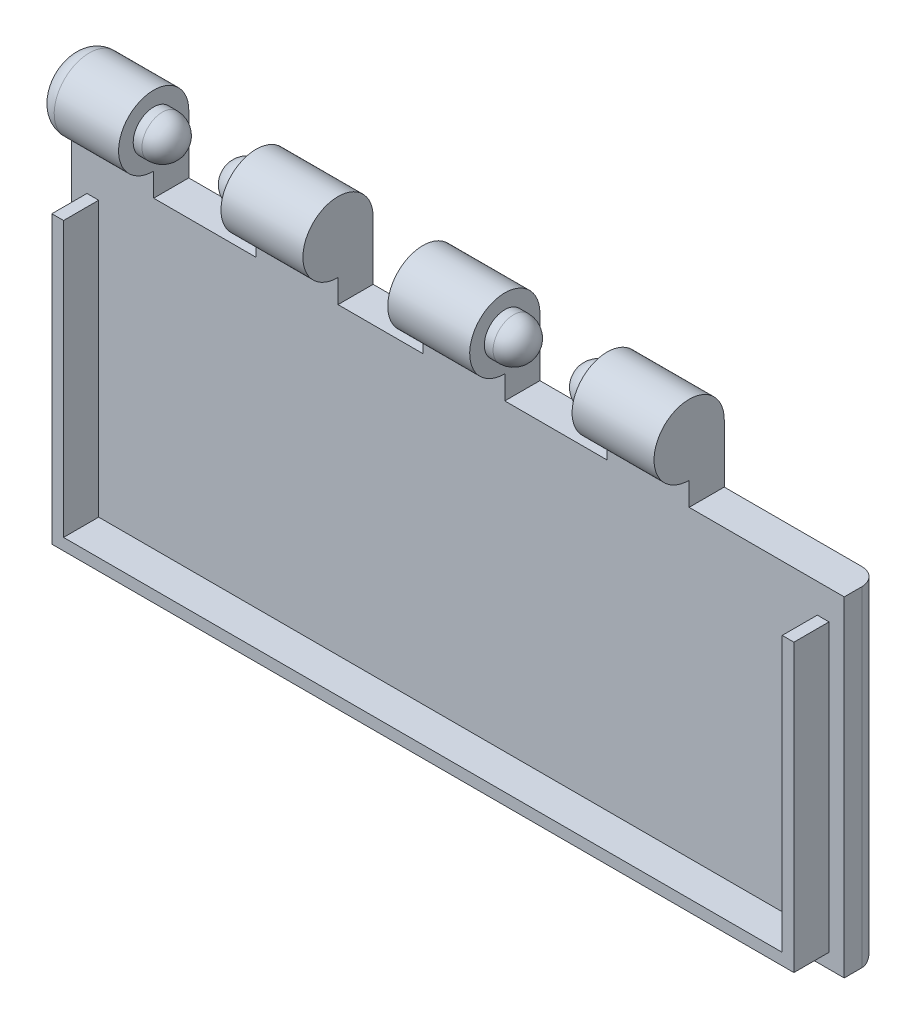
ISO-10303-21;
HEADER;
FILE_DESCRIPTION(('STEP AP214'),'2;1');
FILE_NAME('part.step','',(''),(''),'','','');
FILE_SCHEMA(('AUTOMOTIVE_DESIGN { 1 0 10303 214 1 1 1 1 }'));
ENDSEC;
DATA;
#1=APPLICATION_CONTEXT('core data for automotive mechanical design processes');
#2=APPLICATION_PROTOCOL_DEFINITION('international standard','automotive_design',2000,#1);
#3=PRODUCT_CONTEXT('',#1,'mechanical');
#4=PRODUCT('Part','Part','',(#3));
#5=PRODUCT_RELATED_PRODUCT_CATEGORY('part','',(#4));
#6=PRODUCT_DEFINITION_FORMATION('','',#4);
#7=PRODUCT_DEFINITION_CONTEXT('part definition',#1,'design');
#8=PRODUCT_DEFINITION('design','',#6,#7);
#9=PRODUCT_DEFINITION_SHAPE('','',#8);
#10=(LENGTH_UNIT() NAMED_UNIT(*) SI_UNIT(.MILLI.,.METRE.));
#11=(NAMED_UNIT(*) PLANE_ANGLE_UNIT() SI_UNIT($,.RADIAN.));
#12=(NAMED_UNIT(*) SI_UNIT($,.STERADIAN.) SOLID_ANGLE_UNIT());
#13=UNCERTAINTY_MEASURE_WITH_UNIT(LENGTH_MEASURE(1.E-05),#10,'distance_accuracy_value','');
#14=(GEOMETRIC_REPRESENTATION_CONTEXT(3) GLOBAL_UNCERTAINTY_ASSIGNED_CONTEXT((#13)) GLOBAL_UNIT_ASSIGNED_CONTEXT((#10,
#11,#12)) REPRESENTATION_CONTEXT('',''));
#15=CARTESIAN_POINT('',(0.,0.,0.));
#16=DIRECTION('',(0.,0.,1.));
#17=DIRECTION('',(1.,0.,0.));
#18=AXIS2_PLACEMENT_3D('',#15,#16,#17);
#19=CARTESIAN_POINT('',(0.,0.,3.));
#20=DIRECTION('',(0.,0.,-1.));
#21=DIRECTION('',(-1.,0.,0.));
#22=AXIS2_PLACEMENT_3D('',#19,#20,#21);
#23=PLANE('',#22);
#24=DIRECTION('',(0.,1.,0.));
#25=VECTOR('',#24,1.);
#26=CARTESIAN_POINT('',(33.,-14.1,3.));
#27=LINE('',#26,#25);
#28=CARTESIAN_POINT('',(33.,-14.1,3.));
#29=VERTEX_POINT('',#28);
#30=CARTESIAN_POINT('',(33.,14.1,3.));
#31=VERTEX_POINT('',#30);
#32=EDGE_CURVE('E434',#29,#31,#27,.T.);
#33=ORIENTED_EDGE('',*,*,#32,.T.);
#34=DIRECTION('',(-1.,0.,0.));
#35=VECTOR('',#34,1.);
#36=CARTESIAN_POINT('',(-33.,14.1,3.));
#37=LINE('',#36,#35);
#38=CARTESIAN_POINT('',(19.75,14.1,3.));
#39=VERTEX_POINT('',#38);
#40=EDGE_CURVE('E440',#31,#39,#37,.T.);
#41=ORIENTED_EDGE('',*,*,#40,.T.);
#42=DIRECTION('',(0.,1.,0.));
#43=VECTOR('',#42,1.);
#44=CARTESIAN_POINT('',(19.75,14.1,2.99999999999999));
#45=LINE('',#44,#43);
#46=CARTESIAN_POINT('',(19.75,16.1,2.99999999999999));
#47=VERTEX_POINT('',#46);
#48=EDGE_CURVE('E280',#39,#47,#45,.T.);
#49=ORIENTED_EDGE('',*,*,#48,.T.);
#50=DIRECTION('',(1.,0.,0.));
#51=VECTOR('',#50,1.);
#52=CARTESIAN_POINT('',(12.75,16.1,3.));
#53=LINE('',#52,#51);
#54=CARTESIAN_POINT('',(12.75,16.1,3.));
#55=VERTEX_POINT('',#54);
#56=EDGE_CURVE('E310',#55,#47,#53,.T.);
#57=ORIENTED_EDGE('',*,*,#56,.F.);
#58=DIRECTION('',(0.,1.,0.));
#59=VECTOR('',#58,1.);
#60=CARTESIAN_POINT('',(12.75,14.1,3.));
#61=LINE('',#60,#59);
#62=CARTESIAN_POINT('',(12.75,14.1,3.));
#63=VERTEX_POINT('',#62);
#64=EDGE_CURVE('E281',#63,#55,#61,.T.);
#65=ORIENTED_EDGE('',*,*,#64,.F.);
#66=CARTESIAN_POINT('',(4.,14.1,3.));
#67=VERTEX_POINT('',#66);
#68=EDGE_CURVE('E445',#63,#67,#37,.T.);
#69=ORIENTED_EDGE('',*,*,#68,.T.);
#70=DIRECTION('',(0.,1.,0.));
#71=VECTOR('',#70,1.);
#72=CARTESIAN_POINT('',(4.,14.1,3.));
#73=LINE('',#72,#71);
#74=CARTESIAN_POINT('',(4.,16.1,3.));
#75=VERTEX_POINT('',#74);
#76=EDGE_CURVE('E322',#67,#75,#73,.T.);
#77=ORIENTED_EDGE('',*,*,#76,.T.);
#78=DIRECTION('',(-1.,0.,0.));
#79=VECTOR('',#78,1.);
#80=CARTESIAN_POINT('',(4.,16.1,3.));
#81=LINE('',#80,#79);
#82=CARTESIAN_POINT('',(-3.,16.1,3.));
#83=VERTEX_POINT('',#82);
#84=EDGE_CURVE('E339',#75,#83,#81,.T.);
#85=ORIENTED_EDGE('',*,*,#84,.T.);
#86=DIRECTION('',(0.,1.,0.));
#87=VECTOR('',#86,1.);
#88=CARTESIAN_POINT('',(-3.,14.1,3.));
#89=LINE('',#88,#87);
#90=CARTESIAN_POINT('',(-3.,14.1,3.));
#91=VERTEX_POINT('',#90);
#92=EDGE_CURVE('E321',#91,#83,#89,.T.);
#93=ORIENTED_EDGE('',*,*,#92,.F.);
#94=CARTESIAN_POINT('',(-10.25,14.1,3.));
#95=VERTEX_POINT('',#94);
#96=EDGE_CURVE('E575',#91,#95,#37,.T.);
#97=ORIENTED_EDGE('',*,*,#96,.T.);
#98=DIRECTION('',(0.,1.,0.));
#99=VECTOR('',#98,1.);
#100=CARTESIAN_POINT('',(-10.25,14.1,2.99999999999999));
#101=LINE('',#100,#99);
#102=CARTESIAN_POINT('',(-10.25,16.1,2.99999999999999));
#103=VERTEX_POINT('',#102);
#104=EDGE_CURVE('E367',#95,#103,#101,.T.);
#105=ORIENTED_EDGE('',*,*,#104,.T.);
#106=DIRECTION('',(1.,0.,0.));
#107=VECTOR('',#106,1.);
#108=CARTESIAN_POINT('',(-17.25,16.1,3.));
#109=LINE('',#108,#107);
#110=CARTESIAN_POINT('',(-17.25,16.1,3.));
#111=VERTEX_POINT('',#110);
#112=EDGE_CURVE('E398',#111,#103,#109,.T.);
#113=ORIENTED_EDGE('',*,*,#112,.F.);
#114=DIRECTION('',(0.,1.,0.));
#115=VECTOR('',#114,1.);
#116=CARTESIAN_POINT('',(-17.25,14.1,3.));
#117=LINE('',#116,#115);
#118=CARTESIAN_POINT('',(-17.25,14.1,3.));
#119=VERTEX_POINT('',#118);
#120=EDGE_CURVE('E368',#119,#111,#117,.T.);
#121=ORIENTED_EDGE('',*,*,#120,.F.);
#122=CARTESIAN_POINT('',(-26.,14.1,3.));
#123=VERTEX_POINT('',#122);
#124=EDGE_CURVE('E438',#119,#123,#37,.T.);
#125=ORIENTED_EDGE('',*,*,#124,.T.);
#126=DIRECTION('',(0.,1.,0.));
#127=VECTOR('',#126,1.);
#128=CARTESIAN_POINT('',(-26.,14.1,3.));
#129=LINE('',#128,#127);
#130=CARTESIAN_POINT('',(-26.,16.1,3.));
#131=VERTEX_POINT('',#130);
#132=EDGE_CURVE('E409',#123,#131,#129,.T.);
#133=ORIENTED_EDGE('',*,*,#132,.T.);
#134=DIRECTION('',(-1.,0.,0.));
#135=VECTOR('',#134,1.);
#136=CARTESIAN_POINT('',(-26.,16.1,3.));
#137=LINE('',#136,#135);
#138=CARTESIAN_POINT('',(-31.5,16.1,3.));
#139=VERTEX_POINT('',#138);
#140=EDGE_CURVE('E425',#131,#139,#137,.T.);
#141=ORIENTED_EDGE('',*,*,#140,.T.);
#142=CARTESIAN_POINT('',(-31.5,17.6,3.));
#143=DIRECTION('',(0.,0.,-1.));
#144=DIRECTION('',(-1.,0.,0.));
#145=AXIS2_PLACEMENT_3D('',#142,#143,#144);
#146=CIRCLE('',#145,1.5);
#147=CARTESIAN_POINT('',(-33.,17.6,3.));
#148=VERTEX_POINT('',#147);
#149=EDGE_CURVE('E11',#139,#148,#146,.T.);
#150=ORIENTED_EDGE('',*,*,#149,.T.);
#151=DIRECTION('',(0.,-1.,0.));
#152=VECTOR('',#151,1.);
#153=CARTESIAN_POINT('',(-33.,-14.1,3.));
#154=LINE('',#153,#152);
#155=CARTESIAN_POINT('',(-33.,-14.1,3.));
#156=VERTEX_POINT('',#155);
#157=EDGE_CURVE('E444',#148,#156,#154,.T.);
#158=ORIENTED_EDGE('',*,*,#157,.T.);
#159=DIRECTION('',(1.,0.,0.));
#160=VECTOR('',#159,1.);
#161=CARTESIAN_POINT('',(-33.,-14.1,3.));
#162=LINE('',#161,#160);
#163=EDGE_CURVE('E448',#156,#29,#162,.T.);
#164=ORIENTED_EDGE('',*,*,#163,.T.);
#165=EDGE_LOOP('',(#33,#41,#49,#57,#65,#69,#77,#85,#93,#97,#105,#113,#121,#125,#133,#141,#150,
#158,#164));
#166=FACE_BOUND('',#165,.T.);
#167=DIRECTION('',(0.,-1.,0.));
#168=VECTOR('',#167,1.);
#169=CARTESIAN_POINT('',(-31.7,11.6,3.));
#170=LINE('',#169,#168);
#171=CARTESIAN_POINT('',(-31.7,11.6,3.));
#172=VERTEX_POINT('',#171);
#173=CARTESIAN_POINT('',(-31.7,-12.85,3.));
#174=VERTEX_POINT('',#173);
#175=EDGE_CURVE('E260',#172,#174,#170,.T.);
#176=ORIENTED_EDGE('',*,*,#175,.F.);
#177=DIRECTION('',(-1.,0.,0.));
#178=VECTOR('',#177,1.);
#179=CARTESIAN_POINT('',(-31.7,11.6,3.));
#180=LINE('',#179,#178);
#181=CARTESIAN_POINT('',(-30.7,11.6,3.));
#182=VERTEX_POINT('',#181);
#183=EDGE_CURVE('E257',#182,#172,#180,.T.);
#184=ORIENTED_EDGE('',*,*,#183,.F.);
#185=DIRECTION('',(0.,1.,0.));
#186=VECTOR('',#185,1.);
#187=CARTESIAN_POINT('',(-30.7,11.6,3.));
#188=LINE('',#187,#186);
#189=CARTESIAN_POINT('',(-30.7,-11.85,3.));
#190=VERTEX_POINT('',#189);
#191=EDGE_CURVE('E893',#190,#182,#188,.T.);
#192=ORIENTED_EDGE('',*,*,#191,.F.);
#193=DIRECTION('',(-1.,0.,0.));
#194=VECTOR('',#193,1.);
#195=CARTESIAN_POINT('',(-30.7,-11.85,3.));
#196=LINE('',#195,#194);
#197=CARTESIAN_POINT('',(30.7,-11.85,3.));
#198=VERTEX_POINT('',#197);
#199=EDGE_CURVE('E935',#198,#190,#196,.T.);
#200=ORIENTED_EDGE('',*,*,#199,.F.);
#201=DIRECTION('',(0.,-1.,0.));
#202=VECTOR('',#201,1.);
#203=CARTESIAN_POINT('',(30.7,11.6,3.));
#204=LINE('',#203,#202);
#205=CARTESIAN_POINT('',(30.7,11.6,3.));
#206=VERTEX_POINT('',#205);
#207=EDGE_CURVE('E927',#206,#198,#204,.T.);
#208=ORIENTED_EDGE('',*,*,#207,.F.);
#209=DIRECTION('',(-1.,0.,0.));
#210=VECTOR('',#209,1.);
#211=CARTESIAN_POINT('',(31.7,11.6,3.));
#212=LINE('',#211,#210);
#213=CARTESIAN_POINT('',(31.7,11.6,3.));
#214=VERTEX_POINT('',#213);
#215=EDGE_CURVE('E921',#214,#206,#212,.T.);
#216=ORIENTED_EDGE('',*,*,#215,.F.);
#217=DIRECTION('',(0.,1.,0.));
#218=VECTOR('',#217,1.);
#219=CARTESIAN_POINT('',(31.7,11.6,3.));
#220=LINE('',#219,#218);
#221=CARTESIAN_POINT('',(31.7,-12.85,3.));
#222=VERTEX_POINT('',#221);
#223=EDGE_CURVE('E70',#222,#214,#220,.T.);
#224=ORIENTED_EDGE('',*,*,#223,.F.);
#225=DIRECTION('',(1.,0.,0.));
#226=VECTOR('',#225,1.);
#227=CARTESIAN_POINT('',(-30.7,-12.85,3.));
#228=LINE('',#227,#226);
#229=EDGE_CURVE('E65',#174,#222,#228,.T.);
#230=ORIENTED_EDGE('',*,*,#229,.F.);
#231=EDGE_LOOP('',(#176,#184,#192,#200,#208,#216,#224,#230));
#232=FACE_BOUND('',#231,.T.);
#233=ADVANCED_FACE('F47',(#166,#232),#23,.F.);
#234=CARTESIAN_POINT('',(-33.,14.1,3.));
#235=DIRECTION('',(0.,-1.,0.));
#236=DIRECTION('',(0.,0.,-1.));
#237=AXIS2_PLACEMENT_3D('',#234,#235,#236);
#238=PLANE('',#237);
#239=DIRECTION('',(0.,0.,1.));
#240=VECTOR('',#239,1.);
#241=CARTESIAN_POINT('',(12.75,14.1,0.));
#242=LINE('',#241,#240);
#243=CARTESIAN_POINT('',(12.75,14.1,0.));
#244=VERTEX_POINT('',#243);
#245=EDGE_CURVE('E285',#244,#63,#242,.T.);
#246=ORIENTED_EDGE('',*,*,#245,.F.);
#247=DIRECTION('',(-1.,0.,0.));
#248=VECTOR('',#247,1.);
#249=CARTESIAN_POINT('',(-33.,14.1,0.));
#250=LINE('',#249,#248);
#251=CARTESIAN_POINT('',(4.,14.1,0.));
#252=VERTEX_POINT('',#251);
#253=EDGE_CURVE('E454',#244,#252,#250,.T.);
#254=ORIENTED_EDGE('',*,*,#253,.T.);
#255=DIRECTION('',(0.,0.,1.));
#256=VECTOR('',#255,1.);
#257=CARTESIAN_POINT('',(4.,14.1,0.));
#258=LINE('',#257,#256);
#259=EDGE_CURVE('E335',#252,#67,#258,.T.);
#260=ORIENTED_EDGE('',*,*,#259,.T.);
#261=ORIENTED_EDGE('',*,*,#68,.F.);
#262=EDGE_LOOP('',(#246,#254,#260,#261));
#263=FACE_BOUND('',#262,.T.);
#264=ADVANCED_FACE('F571',(#263),#238,.F.);
#265=DIRECTION('',(0.,0.,-1.));
#266=VECTOR('',#265,1.);
#267=CARTESIAN_POINT('',(33.,14.1,3.));
#268=LINE('',#267,#266);
#269=CARTESIAN_POINT('',(33.,14.1,1.5));
#270=VERTEX_POINT('',#269);
#271=EDGE_CURVE('E462',#31,#270,#268,.T.);
#272=ORIENTED_EDGE('',*,*,#271,.T.);
#273=CARTESIAN_POINT('',(31.5,14.1,1.5));
#274=DIRECTION('',(0.,-1.,0.));
#275=DIRECTION('',(0.,0.,-1.));
#276=AXIS2_PLACEMENT_3D('',#273,#274,#275);
#277=CIRCLE('',#276,1.5);
#278=CARTESIAN_POINT('',(31.5,14.1,0.));
#279=VERTEX_POINT('',#278);
#280=EDGE_CURVE('E57',#270,#279,#277,.F.);
#281=ORIENTED_EDGE('',*,*,#280,.T.);
#282=CARTESIAN_POINT('',(19.75,14.1,0.));
#283=VERTEX_POINT('',#282);
#284=EDGE_CURVE('E439',#279,#283,#250,.T.);
#285=ORIENTED_EDGE('',*,*,#284,.T.);
#286=DIRECTION('',(0.,0.,1.));
#287=VECTOR('',#286,1.);
#288=CARTESIAN_POINT('',(19.75,14.1,0.));
#289=LINE('',#288,#287);
#290=EDGE_CURVE('E301',#283,#39,#289,.T.);
#291=ORIENTED_EDGE('',*,*,#290,.T.);
#292=ORIENTED_EDGE('',*,*,#40,.F.);
#293=EDGE_LOOP('',(#272,#281,#285,#291,#292));
#294=FACE_BOUND('',#293,.T.);
#295=ADVANCED_FACE('F523',(#294),#238,.F.);
#296=DIRECTION('',(0.,0.,1.));
#297=VECTOR('',#296,1.);
#298=CARTESIAN_POINT('',(-17.25,14.1,0.));
#299=LINE('',#298,#297);
#300=CARTESIAN_POINT('',(-17.25,14.1,0.));
#301=VERTEX_POINT('',#300);
#302=EDGE_CURVE('E372',#301,#119,#299,.T.);
#303=ORIENTED_EDGE('',*,*,#302,.F.);
#304=CARTESIAN_POINT('',(-26.,14.1,0.));
#305=VERTEX_POINT('',#304);
#306=EDGE_CURVE('E430',#301,#305,#250,.T.);
#307=ORIENTED_EDGE('',*,*,#306,.T.);
#308=DIRECTION('',(0.,0.,1.));
#309=VECTOR('',#308,1.);
#310=CARTESIAN_POINT('',(-26.,14.1,0.));
#311=LINE('',#310,#309);
#312=EDGE_CURVE('E421',#305,#123,#311,.T.);
#313=ORIENTED_EDGE('',*,*,#312,.T.);
#314=ORIENTED_EDGE('',*,*,#124,.F.);
#315=EDGE_LOOP('',(#303,#307,#313,#314));
#316=FACE_BOUND('',#315,.T.);
#317=ADVANCED_FACE('F552',(#316),#238,.F.);
#318=CARTESIAN_POINT('',(33.,-14.1,3.));
#319=DIRECTION('',(-1.,0.,0.));
#320=DIRECTION('',(0.,0.,1.));
#321=AXIS2_PLACEMENT_3D('',#318,#319,#320);
#322=PLANE('',#321);
#323=DIRECTION('',(0.,0.,-1.));
#324=VECTOR('',#323,1.);
#325=CARTESIAN_POINT('',(33.,-14.1,3.));
#326=LINE('',#325,#324);
#327=CARTESIAN_POINT('',(33.,-14.1,1.5));
#328=VERTEX_POINT('',#327);
#329=EDGE_CURVE('E451',#29,#328,#326,.T.);
#330=ORIENTED_EDGE('',*,*,#329,.T.);
#331=DIRECTION('',(0.,1.,0.));
#332=VECTOR('',#331,1.);
#333=CARTESIAN_POINT('',(33.,14.1,1.5));
#334=LINE('',#333,#332);
#335=EDGE_CURVE('E496',#328,#270,#334,.T.);
#336=ORIENTED_EDGE('',*,*,#335,.T.);
#337=ORIENTED_EDGE('',*,*,#271,.F.);
#338=ORIENTED_EDGE('',*,*,#32,.F.);
#339=EDGE_LOOP('',(#330,#336,#337,#338));
#340=FACE_BOUND('',#339,.T.);
#341=ADVANCED_FACE('F519',(#340),#322,.F.);
#342=ORIENTED_EDGE('',*,*,#96,.F.);
#343=DIRECTION('',(0.,0.,1.));
#344=VECTOR('',#343,1.);
#345=CARTESIAN_POINT('',(-3.,14.1,0.));
#346=LINE('',#345,#344);
#347=CARTESIAN_POINT('',(-3.,14.1,0.));
#348=VERTEX_POINT('',#347);
#349=EDGE_CURVE('E327',#348,#91,#346,.T.);
#350=ORIENTED_EDGE('',*,*,#349,.F.);
#351=CARTESIAN_POINT('',(-10.25,14.1,0.));
#352=VERTEX_POINT('',#351);
#353=EDGE_CURVE('E556',#348,#352,#250,.T.);
#354=ORIENTED_EDGE('',*,*,#353,.T.);
#355=DIRECTION('',(0.,0.,1.));
#356=VECTOR('',#355,1.);
#357=CARTESIAN_POINT('',(-10.25,14.1,0.));
#358=LINE('',#357,#356);
#359=EDGE_CURVE('E388',#352,#95,#358,.T.);
#360=ORIENTED_EDGE('',*,*,#359,.T.);
#361=EDGE_LOOP('',(#342,#350,#354,#360));
#362=FACE_BOUND('',#361,.T.);
#363=ADVANCED_FACE('F583',(#362),#238,.F.);
#364=CARTESIAN_POINT('',(-33.,-14.1,3.));
#365=DIRECTION('',(1.,0.,0.));
#366=DIRECTION('',(0.,0.,-1.));
#367=AXIS2_PLACEMENT_3D('',#364,#365,#366);
#368=PLANE('',#367);
#369=ORIENTED_EDGE('',*,*,#157,.F.);
#370=CARTESIAN_POINT('',(-33.,19.1,3.));
#371=DIRECTION('',(1.,0.,0.));
#372=DIRECTION('',(0.,0.,-1.));
#373=AXIS2_PLACEMENT_3D('',#370,#371,#372);
#374=CIRCLE('',#373,1.5);
#375=CARTESIAN_POINT('',(-33.,19.1,1.5));
#376=VERTEX_POINT('',#375);
#377=EDGE_CURVE('E477',#148,#376,#374,.F.);
#378=ORIENTED_EDGE('',*,*,#377,.T.);
#379=DIRECTION('',(0.,-1.,0.));
#380=VECTOR('',#379,1.);
#381=CARTESIAN_POINT('',(-33.,-14.1,1.5));
#382=LINE('',#381,#380);
#383=CARTESIAN_POINT('',(-33.,-14.1,1.5));
#384=VERTEX_POINT('',#383);
#385=EDGE_CURVE('E474',#376,#384,#382,.T.);
#386=ORIENTED_EDGE('',*,*,#385,.T.);
#387=DIRECTION('',(0.,0.,-1.));
#388=VECTOR('',#387,1.);
#389=CARTESIAN_POINT('',(-33.,-14.1,3.));
#390=LINE('',#389,#388);
#391=EDGE_CURVE('E458',#156,#384,#390,.T.);
#392=ORIENTED_EDGE('',*,*,#391,.F.);
#393=EDGE_LOOP('',(#369,#378,#386,#392));
#394=FACE_BOUND('',#393,.T.);
#395=ADVANCED_FACE('F533',(#394),#368,.F.);
#396=CARTESIAN_POINT('',(-33.,-14.1,3.));
#397=DIRECTION('',(0.,1.,0.));
#398=DIRECTION('',(0.,0.,1.));
#399=AXIS2_PLACEMENT_3D('',#396,#397,#398);
#400=PLANE('',#399);
#401=ORIENTED_EDGE('',*,*,#391,.T.);
#402=DIRECTION('',(1.,0.,0.));
#403=VECTOR('',#402,1.);
#404=CARTESIAN_POINT('',(33.,-14.1,1.5));
#405=LINE('',#404,#403);
#406=EDGE_CURVE('E493',#384,#328,#405,.T.);
#407=ORIENTED_EDGE('',*,*,#406,.T.);
#408=ORIENTED_EDGE('',*,*,#329,.F.);
#409=ORIENTED_EDGE('',*,*,#163,.F.);
#410=EDGE_LOOP('',(#401,#407,#408,#409));
#411=FACE_BOUND('',#410,.T.);
#412=ADVANCED_FACE('F531',(#411),#400,.F.);
#413=CARTESIAN_POINT('',(0.,0.,0.));
#414=DIRECTION('',(0.,0.,-1.));
#415=DIRECTION('',(-1.,0.,0.));
#416=AXIS2_PLACEMENT_3D('',#413,#414,#415);
#417=PLANE('',#416);
#418=DIRECTION('',(1.,0.,0.));
#419=VECTOR('',#418,1.);
#420=CARTESIAN_POINT('',(-33.,-12.6,0.));
#421=LINE('',#420,#419);
#422=CARTESIAN_POINT('',(31.5,-12.6,0.));
#423=VERTEX_POINT('',#422);
#424=CARTESIAN_POINT('',(-31.5,-12.6,0.));
#425=VERTEX_POINT('',#424);
#426=EDGE_CURVE('E487',#423,#425,#421,.F.);
#427=ORIENTED_EDGE('',*,*,#426,.T.);
#428=DIRECTION('',(0.,-1.,0.));
#429=VECTOR('',#428,1.);
#430=CARTESIAN_POINT('',(-31.5,19.1,0.));
#431=LINE('',#430,#429);
#432=CARTESIAN_POINT('',(-31.5,19.1,0.));
#433=VERTEX_POINT('',#432);
#434=EDGE_CURVE('E490',#425,#433,#431,.F.);
#435=ORIENTED_EDGE('',*,*,#434,.T.);
#436=DIRECTION('',(-1.,0.,0.));
#437=VECTOR('',#436,1.);
#438=CARTESIAN_POINT('',(-26.,19.1,0.));
#439=LINE('',#438,#437);
#440=CARTESIAN_POINT('',(-26.,19.1,0.));
#441=VERTEX_POINT('',#440);
#442=EDGE_CURVE('E426',#441,#433,#439,.T.);
#443=ORIENTED_EDGE('',*,*,#442,.F.);
#444=DIRECTION('',(0.,-1.,0.));
#445=VECTOR('',#444,1.);
#446=CARTESIAN_POINT('',(-26.,19.1,0.));
#447=LINE('',#446,#445);
#448=EDGE_CURVE('E417',#441,#305,#447,.T.);
#449=ORIENTED_EDGE('',*,*,#448,.T.);
#450=ORIENTED_EDGE('',*,*,#306,.F.);
#451=DIRECTION('',(0.,-1.,0.));
#452=VECTOR('',#451,1.);
#453=CARTESIAN_POINT('',(-17.25,19.1,0.));
#454=LINE('',#453,#452);
#455=CARTESIAN_POINT('',(-17.25,19.1,0.));
#456=VERTEX_POINT('',#455);
#457=EDGE_CURVE('E377',#456,#301,#454,.T.);
#458=ORIENTED_EDGE('',*,*,#457,.F.);
#459=DIRECTION('',(1.,0.,0.));
#460=VECTOR('',#459,1.);
#461=CARTESIAN_POINT('',(-17.25,19.1,0.));
#462=LINE('',#461,#460);
#463=CARTESIAN_POINT('',(-10.25,19.1,0.));
#464=VERTEX_POINT('',#463);
#465=EDGE_CURVE('E384',#456,#464,#462,.T.);
#466=ORIENTED_EDGE('',*,*,#465,.T.);
#467=DIRECTION('',(0.,-1.,0.));
#468=VECTOR('',#467,1.);
#469=CARTESIAN_POINT('',(-10.25,19.1,0.));
#470=LINE('',#469,#468);
#471=EDGE_CURVE('E392',#464,#352,#470,.T.);
#472=ORIENTED_EDGE('',*,*,#471,.T.);
#473=ORIENTED_EDGE('',*,*,#353,.F.);
#474=DIRECTION('',(0.,-1.,0.));
#475=VECTOR('',#474,1.);
#476=CARTESIAN_POINT('',(-3.,19.1,0.));
#477=LINE('',#476,#475);
#478=CARTESIAN_POINT('',(-3.,19.1,0.));
#479=VERTEX_POINT('',#478);
#480=EDGE_CURVE('E347',#479,#348,#477,.T.);
#481=ORIENTED_EDGE('',*,*,#480,.F.);
#482=DIRECTION('',(-1.,0.,0.));
#483=VECTOR('',#482,1.);
#484=CARTESIAN_POINT('',(4.,19.1,0.));
#485=LINE('',#484,#483);
#486=CARTESIAN_POINT('',(4.,19.1,0.));
#487=VERTEX_POINT('',#486);
#488=EDGE_CURVE('E354',#487,#479,#485,.T.);
#489=ORIENTED_EDGE('',*,*,#488,.F.);
#490=DIRECTION('',(0.,-1.,0.));
#491=VECTOR('',#490,1.);
#492=CARTESIAN_POINT('',(4.,19.1,0.));
#493=LINE('',#492,#491);
#494=EDGE_CURVE('E331',#487,#252,#493,.T.);
#495=ORIENTED_EDGE('',*,*,#494,.T.);
#496=ORIENTED_EDGE('',*,*,#253,.F.);
#497=DIRECTION('',(0.,-1.,0.));
#498=VECTOR('',#497,1.);
#499=CARTESIAN_POINT('',(12.75,19.1,0.));
#500=LINE('',#499,#498);
#501=CARTESIAN_POINT('',(12.75,19.1,0.));
#502=VERTEX_POINT('',#501);
#503=EDGE_CURVE('E290',#502,#244,#500,.T.);
#504=ORIENTED_EDGE('',*,*,#503,.F.);
#505=DIRECTION('',(1.,0.,0.));
#506=VECTOR('',#505,1.);
#507=CARTESIAN_POINT('',(12.75,19.1,0.));
#508=LINE('',#507,#506);
#509=CARTESIAN_POINT('',(19.75,19.1,0.));
#510=VERTEX_POINT('',#509);
#511=EDGE_CURVE('E297',#502,#510,#508,.T.);
#512=ORIENTED_EDGE('',*,*,#511,.T.);
#513=DIRECTION('',(0.,-1.,0.));
#514=VECTOR('',#513,1.);
#515=CARTESIAN_POINT('',(19.75,19.1,0.));
#516=LINE('',#515,#514);
#517=EDGE_CURVE('E304',#510,#283,#516,.T.);
#518=ORIENTED_EDGE('',*,*,#517,.T.);
#519=ORIENTED_EDGE('',*,*,#284,.F.);
#520=DIRECTION('',(0.,1.,0.));
#521=VECTOR('',#520,1.);
#522=CARTESIAN_POINT('',(31.5,-14.1,0.));
#523=LINE('',#522,#521);
#524=EDGE_CURVE('E484',#279,#423,#523,.F.);
#525=ORIENTED_EDGE('',*,*,#524,.T.);
#526=EDGE_LOOP('',(#427,#435,#443,#449,#450,#458,#466,#472,#473,#481,#489,#495,#496,#504,#512,
#518,#519,#525));
#527=FACE_BOUND('',#526,.T.);
#528=ADVANCED_FACE('F557',(#527),#417,.T.);
#529=CARTESIAN_POINT('',(-26.,19.1,3.));
#530=DIRECTION('',(-1.,0.,0.));
#531=DIRECTION('',(0.,0.,1.));
#532=AXIS2_PLACEMENT_3D('',#529,#530,#531);
#533=CYLINDRICAL_SURFACE('',#532,3.);
#534=ORIENTED_EDGE('',*,*,#442,.T.);
#535=CARTESIAN_POINT('',(-31.5,19.1,3.));
#536=DIRECTION('',(1.,0.,0.));
#537=DIRECTION('',(0.,0.,-1.));
#538=AXIS2_PLACEMENT_3D('',#535,#536,#537);
#539=CIRCLE('',#538,3.);
#540=EDGE_CURVE('E481',#433,#139,#539,.T.);
#541=ORIENTED_EDGE('',*,*,#540,.T.);
#542=ORIENTED_EDGE('',*,*,#140,.F.);
#543=CARTESIAN_POINT('',(-26.,19.1,3.));
#544=DIRECTION('',(-1.,0.,0.));
#545=DIRECTION('',(0.,0.,1.));
#546=AXIS2_PLACEMENT_3D('',#543,#544,#545);
#547=CIRCLE('',#546,3.);
#548=EDGE_CURVE('E413',#131,#441,#547,.T.);
#549=ORIENTED_EDGE('',*,*,#548,.T.);
#550=EDGE_LOOP('',(#534,#541,#542,#549));
#551=FACE_BOUND('',#550,.T.);
#552=ADVANCED_FACE('F542',(#551),#533,.T.);
#553=CARTESIAN_POINT('',(-26.,19.1,3.));
#554=DIRECTION('',(-1.,0.,0.));
#555=DIRECTION('',(0.,0.,1.));
#556=AXIS2_PLACEMENT_3D('',#553,#554,#555);
#557=PLANE('',#556);
#558=CARTESIAN_POINT('',(-26.,19.1,3.));
#559=DIRECTION('',(-1.,0.,0.));
#560=DIRECTION('',(0.,0.,1.));
#561=AXIS2_PLACEMENT_3D('',#558,#559,#560);
#562=CIRCLE('',#561,1.75);
#563=CARTESIAN_POINT('',(-26.,19.1,4.75));
#564=VERTEX_POINT('',#563);
#565=EDGE_CURVE('E466',#564,#564,#562,.F.);
#566=ORIENTED_EDGE('',*,*,#565,.F.);
#567=EDGE_LOOP('',(#566));
#568=FACE_BOUND('',#567,.T.);
#569=ORIENTED_EDGE('',*,*,#132,.F.);
#570=ORIENTED_EDGE('',*,*,#312,.F.);
#571=ORIENTED_EDGE('',*,*,#448,.F.);
#572=ORIENTED_EDGE('',*,*,#548,.F.);
#573=EDGE_LOOP('',(#569,#570,#571,#572));
#574=FACE_BOUND('',#573,.T.);
#575=ADVANCED_FACE('F548',(#568,#574),#557,.F.);
#576=CARTESIAN_POINT('',(-25.25,19.1,3.));
#577=DIRECTION('',(-1.,0.,0.));
#578=DIRECTION('',(0.,0.,1.));
#579=AXIS2_PLACEMENT_3D('',#576,#577,#578);
#580=CYLINDRICAL_SURFACE('',#579,1.75);
#581=CARTESIAN_POINT('',(-25.25,19.1,3.));
#582=DIRECTION('',(1.,0.,0.));
#583=DIRECTION('',(0.,0.,-1.));
#584=AXIS2_PLACEMENT_3D('',#581,#582,#583);
#585=CIRCLE('',#584,1.75);
#586=CARTESIAN_POINT('',(-25.25,19.1,1.25));
#587=VERTEX_POINT('',#586);
#588=EDGE_CURVE('E402',#587,#587,#585,.T.);
#589=ORIENTED_EDGE('',*,*,#588,.F.);
#590=EDGE_LOOP('',(#589));
#591=FACE_BOUND('',#590,.T.);
#592=ORIENTED_EDGE('',*,*,#565,.T.);
#593=EDGE_LOOP('',(#592));
#594=FACE_BOUND('',#593,.T.);
#595=ADVANCED_FACE('F997',(#591,#594),#580,.T.);
#596=CARTESIAN_POINT('',(-25.25,19.1,3.));
#597=DIRECTION('',(0.,1.,0.));
#598=DIRECTION('',(0.,0.,1.));
#599=AXIS2_PLACEMENT_3D('',#596,#597,#598);
#600=SPHERICAL_SURFACE('',#599,1.75);
#601=CARTESIAN_POINT('',(-25.25,19.1,3.));
#602=DIRECTION('',(1.,0.,0.));
#603=DIRECTION('',(0.,0.,-1.));
#604=AXIS2_PLACEMENT_3D('',#601,#602,#603);
#605=SPHERICAL_SURFACE('',#604,1.75);
#606=ORIENTED_EDGE('',*,*,#588,.T.);
#607=EDGE_LOOP('',(#606));
#608=FACE_BOUND('',#607,.T.);
#609=ADVANCED_FACE('F605',(#608),#605,.T.);
#610=CARTESIAN_POINT('',(-17.25,19.1,3.));
#611=DIRECTION('',(1.,0.,0.));
#612=DIRECTION('',(0.,0.,-1.));
#613=AXIS2_PLACEMENT_3D('',#610,#611,#612);
#614=CYLINDRICAL_SURFACE('',#613,3.);
#615=CARTESIAN_POINT('',(-10.25,19.1,2.99999999999999));
#616=DIRECTION('',(-1.,0.,0.));
#617=DIRECTION('',(0.,0.,1.));
#618=AXIS2_PLACEMENT_3D('',#615,#616,#617);
#619=CIRCLE('',#618,3.);
#620=EDGE_CURVE('E373',#103,#464,#619,.T.);
#621=ORIENTED_EDGE('',*,*,#620,.T.);
#622=ORIENTED_EDGE('',*,*,#465,.F.);
#623=CARTESIAN_POINT('',(-17.25,19.1,3.));
#624=DIRECTION('',(-1.,0.,0.));
#625=DIRECTION('',(0.,0.,1.));
#626=AXIS2_PLACEMENT_3D('',#623,#624,#625);
#627=CIRCLE('',#626,3.);
#628=EDGE_CURVE('E381',#111,#456,#627,.T.);
#629=ORIENTED_EDGE('',*,*,#628,.F.);
#630=ORIENTED_EDGE('',*,*,#112,.T.);
#631=EDGE_LOOP('',(#621,#622,#629,#630));
#632=FACE_BOUND('',#631,.T.);
#633=ADVANCED_FACE('F593',(#632),#614,.T.);
#634=CARTESIAN_POINT('',(-17.25,19.1,3.));
#635=DIRECTION('',(1.,0.,0.));
#636=DIRECTION('',(0.,0.,1.));
#637=AXIS2_PLACEMENT_3D('',#634,#635,#636);
#638=PLANE('',#637);
#639=CARTESIAN_POINT('',(-17.25,19.1,3.));
#640=DIRECTION('',(1.,0.,0.));
#641=DIRECTION('',(0.,0.,-1.));
#642=AXIS2_PLACEMENT_3D('',#639,#640,#641);
#643=CIRCLE('',#642,1.75);
#644=CARTESIAN_POINT('',(-17.25,19.1,1.25));
#645=VERTEX_POINT('',#644);
#646=EDGE_CURVE('E363',#645,#645,#643,.T.);
#647=ORIENTED_EDGE('',*,*,#646,.T.);
#648=EDGE_LOOP('',(#647));
#649=FACE_BOUND('',#648,.T.);
#650=ORIENTED_EDGE('',*,*,#120,.T.);
#651=ORIENTED_EDGE('',*,*,#628,.T.);
#652=ORIENTED_EDGE('',*,*,#457,.T.);
#653=ORIENTED_EDGE('',*,*,#302,.T.);
#654=EDGE_LOOP('',(#650,#651,#652,#653));
#655=FACE_BOUND('',#654,.T.);
#656=ADVANCED_FACE('F595',(#649,#655),#638,.F.);
#657=CARTESIAN_POINT('',(-10.25,19.1,2.99999999999999));
#658=DIRECTION('',(1.,0.,0.));
#659=DIRECTION('',(0.,0.,1.));
#660=AXIS2_PLACEMENT_3D('',#657,#658,#659);
#661=PLANE('',#660);
#662=ORIENTED_EDGE('',*,*,#104,.F.);
#663=ORIENTED_EDGE('',*,*,#359,.F.);
#664=ORIENTED_EDGE('',*,*,#471,.F.);
#665=ORIENTED_EDGE('',*,*,#620,.F.);
#666=EDGE_LOOP('',(#662,#663,#664,#665));
#667=FACE_BOUND('',#666,.T.);
#668=ADVANCED_FACE('F590',(#667),#661,.T.);
#669=CARTESIAN_POINT('',(-18.,19.1,3.));
#670=DIRECTION('',(1.,0.,0.));
#671=DIRECTION('',(0.,0.,-1.));
#672=AXIS2_PLACEMENT_3D('',#669,#670,#671);
#673=CYLINDRICAL_SURFACE('',#672,1.75);
#674=CARTESIAN_POINT('',(-18.,19.1,3.));
#675=DIRECTION('',(-1.,0.,0.));
#676=DIRECTION('',(0.,0.,1.));
#677=AXIS2_PLACEMENT_3D('',#674,#675,#676);
#678=CIRCLE('',#677,1.75);
#679=CARTESIAN_POINT('',(-18.,19.1,4.75));
#680=VERTEX_POINT('',#679);
#681=EDGE_CURVE('E357',#680,#680,#678,.T.);
#682=ORIENTED_EDGE('',*,*,#681,.F.);
#683=EDGE_LOOP('',(#682));
#684=FACE_BOUND('',#683,.T.);
#685=ORIENTED_EDGE('',*,*,#646,.F.);
#686=EDGE_LOOP('',(#685));
#687=FACE_BOUND('',#686,.T.);
#688=ADVANCED_FACE('F603',(#684,#687),#673,.T.);
#689=CARTESIAN_POINT('',(-18.,19.1,3.));
#690=DIRECTION('',(0.,1.,0.));
#691=DIRECTION('',(0.,0.,1.));
#692=AXIS2_PLACEMENT_3D('',#689,#690,#691);
#693=SPHERICAL_SURFACE('',#692,1.75);
#694=CARTESIAN_POINT('',(-18.,19.1,3.));
#695=DIRECTION('',(-1.,0.,0.));
#696=DIRECTION('',(0.,0.,1.));
#697=AXIS2_PLACEMENT_3D('',#694,#695,#696);
#698=SPHERICAL_SURFACE('',#697,1.75);
#699=ORIENTED_EDGE('',*,*,#681,.T.);
#700=EDGE_LOOP('',(#699));
#701=FACE_BOUND('',#700,.T.);
#702=ADVANCED_FACE('F677',(#701),#698,.T.);
#703=CARTESIAN_POINT('',(4.,19.1,3.));
#704=DIRECTION('',(-1.,0.,0.));
#705=DIRECTION('',(0.,0.,1.));
#706=AXIS2_PLACEMENT_3D('',#703,#704,#705);
#707=CYLINDRICAL_SURFACE('',#706,3.);
#708=CARTESIAN_POINT('',(-3.,19.1,3.));
#709=DIRECTION('',(-1.,0.,0.));
#710=DIRECTION('',(0.,0.,1.));
#711=AXIS2_PLACEMENT_3D('',#708,#709,#710);
#712=CIRCLE('',#711,3.);
#713=EDGE_CURVE('E343',#83,#479,#712,.T.);
#714=ORIENTED_EDGE('',*,*,#713,.F.);
#715=ORIENTED_EDGE('',*,*,#84,.F.);
#716=CARTESIAN_POINT('',(4.,19.1,3.));
#717=DIRECTION('',(-1.,0.,0.));
#718=DIRECTION('',(0.,0.,1.));
#719=AXIS2_PLACEMENT_3D('',#716,#717,#718);
#720=CIRCLE('',#719,3.);
#721=EDGE_CURVE('E326',#75,#487,#720,.T.);
#722=ORIENTED_EDGE('',*,*,#721,.T.);
#723=ORIENTED_EDGE('',*,*,#488,.T.);
#724=EDGE_LOOP('',(#714,#715,#722,#723));
#725=FACE_BOUND('',#724,.T.);
#726=ADVANCED_FACE('F670',(#725),#707,.T.);
#727=CARTESIAN_POINT('',(4.,19.1,3.));
#728=DIRECTION('',(-1.,0.,0.));
#729=DIRECTION('',(0.,0.,1.));
#730=AXIS2_PLACEMENT_3D('',#727,#728,#729);
#731=PLANE('',#730);
#732=CARTESIAN_POINT('',(4.,19.1,3.));
#733=DIRECTION('',(-1.,0.,0.));
#734=DIRECTION('',(0.,0.,1.));
#735=AXIS2_PLACEMENT_3D('',#732,#733,#734);
#736=CIRCLE('',#735,1.75);
#737=CARTESIAN_POINT('',(4.,19.1,4.75));
#738=VERTEX_POINT('',#737);
#739=EDGE_CURVE('E470',#738,#738,#736,.F.);
#740=ORIENTED_EDGE('',*,*,#739,.F.);
#741=EDGE_LOOP('',(#740));
#742=FACE_BOUND('',#741,.T.);
#743=ORIENTED_EDGE('',*,*,#76,.F.);
#744=ORIENTED_EDGE('',*,*,#259,.F.);
#745=ORIENTED_EDGE('',*,*,#494,.F.);
#746=ORIENTED_EDGE('',*,*,#721,.F.);
#747=EDGE_LOOP('',(#743,#744,#745,#746));
#748=FACE_BOUND('',#747,.T.);
#749=ADVANCED_FACE('F667',(#742,#748),#731,.F.);
#750=CARTESIAN_POINT('',(-3.,19.1,3.));
#751=DIRECTION('',(-1.,0.,0.));
#752=DIRECTION('',(0.,0.,1.));
#753=AXIS2_PLACEMENT_3D('',#750,#751,#752);
#754=PLANE('',#753);
#755=ORIENTED_EDGE('',*,*,#92,.T.);
#756=ORIENTED_EDGE('',*,*,#713,.T.);
#757=ORIENTED_EDGE('',*,*,#480,.T.);
#758=ORIENTED_EDGE('',*,*,#349,.T.);
#759=EDGE_LOOP('',(#755,#756,#757,#758));
#760=FACE_BOUND('',#759,.T.);
#761=ADVANCED_FACE('F665',(#760),#754,.T.);
#762=CARTESIAN_POINT('',(4.75,19.1,3.));
#763=DIRECTION('',(-1.,0.,0.));
#764=DIRECTION('',(0.,0.,1.));
#765=AXIS2_PLACEMENT_3D('',#762,#763,#764);
#766=CYLINDRICAL_SURFACE('',#765,1.75);
#767=CARTESIAN_POINT('',(4.75,19.1,3.));
#768=DIRECTION('',(1.,0.,0.));
#769=DIRECTION('',(0.,0.,-1.));
#770=AXIS2_PLACEMENT_3D('',#767,#768,#769);
#771=CIRCLE('',#770,1.75);
#772=CARTESIAN_POINT('',(4.75,19.1,1.25));
#773=VERTEX_POINT('',#772);
#774=EDGE_CURVE('E314',#773,#773,#771,.T.);
#775=ORIENTED_EDGE('',*,*,#774,.F.);
#776=EDGE_LOOP('',(#775));
#777=FACE_BOUND('',#776,.T.);
#778=ORIENTED_EDGE('',*,*,#739,.T.);
#779=EDGE_LOOP('',(#778));
#780=FACE_BOUND('',#779,.T.);
#781=ADVANCED_FACE('F661',(#777,#780),#766,.T.);
#782=CARTESIAN_POINT('',(4.75,19.1,3.));
#783=DIRECTION('',(0.,1.,0.));
#784=DIRECTION('',(0.,0.,1.));
#785=AXIS2_PLACEMENT_3D('',#782,#783,#784);
#786=SPHERICAL_SURFACE('',#785,1.75);
#787=CARTESIAN_POINT('',(4.75,19.1,3.));
#788=DIRECTION('',(1.,0.,0.));
#789=DIRECTION('',(0.,0.,-1.));
#790=AXIS2_PLACEMENT_3D('',#787,#788,#789);
#791=SPHERICAL_SURFACE('',#790,1.75);
#792=ORIENTED_EDGE('',*,*,#774,.T.);
#793=EDGE_LOOP('',(#792));
#794=FACE_BOUND('',#793,.T.);
#795=ADVANCED_FACE('F658',(#794),#791,.T.);
#796=CARTESIAN_POINT('',(12.75,19.1,3.));
#797=DIRECTION('',(1.,0.,0.));
#798=DIRECTION('',(0.,0.,-1.));
#799=AXIS2_PLACEMENT_3D('',#796,#797,#798);
#800=CYLINDRICAL_SURFACE('',#799,3.);
#801=CARTESIAN_POINT('',(19.75,19.1,2.99999999999999));
#802=DIRECTION('',(-1.,0.,0.));
#803=DIRECTION('',(0.,0.,1.));
#804=AXIS2_PLACEMENT_3D('',#801,#802,#803);
#805=CIRCLE('',#804,3.);
#806=EDGE_CURVE('E286',#47,#510,#805,.T.);
#807=ORIENTED_EDGE('',*,*,#806,.T.);
#808=ORIENTED_EDGE('',*,*,#511,.F.);
#809=CARTESIAN_POINT('',(12.75,19.1,3.));
#810=DIRECTION('',(-1.,0.,0.));
#811=DIRECTION('',(0.,0.,1.));
#812=AXIS2_PLACEMENT_3D('',#809,#810,#811);
#813=CIRCLE('',#812,3.);
#814=EDGE_CURVE('E294',#55,#502,#813,.T.);
#815=ORIENTED_EDGE('',*,*,#814,.F.);
#816=ORIENTED_EDGE('',*,*,#56,.T.);
#817=EDGE_LOOP('',(#807,#808,#815,#816));
#818=FACE_BOUND('',#817,.T.);
#819=ADVANCED_FACE('F566',(#818),#800,.T.);
#820=CARTESIAN_POINT('',(12.75,19.1,3.));
#821=DIRECTION('',(1.,0.,0.));
#822=DIRECTION('',(0.,0.,1.));
#823=AXIS2_PLACEMENT_3D('',#820,#821,#822);
#824=PLANE('',#823);
#825=CARTESIAN_POINT('',(12.75,19.1,3.));
#826=DIRECTION('',(1.,0.,0.));
#827=DIRECTION('',(0.,0.,-1.));
#828=AXIS2_PLACEMENT_3D('',#825,#826,#827);
#829=CIRCLE('',#828,1.75);
#830=CARTESIAN_POINT('',(12.75,19.1,1.25));
#831=VERTEX_POINT('',#830);
#832=EDGE_CURVE('E276',#831,#831,#829,.T.);
#833=ORIENTED_EDGE('',*,*,#832,.T.);
#834=EDGE_LOOP('',(#833));
#835=FACE_BOUND('',#834,.T.);
#836=ORIENTED_EDGE('',*,*,#64,.T.);
#837=ORIENTED_EDGE('',*,*,#814,.T.);
#838=ORIENTED_EDGE('',*,*,#503,.T.);
#839=ORIENTED_EDGE('',*,*,#245,.T.);
#840=EDGE_LOOP('',(#836,#837,#838,#839));
#841=FACE_BOUND('',#840,.T.);
#842=ADVANCED_FACE('F568',(#835,#841),#824,.F.);
#843=CARTESIAN_POINT('',(19.75,19.1,2.99999999999999));
#844=DIRECTION('',(1.,0.,0.));
#845=DIRECTION('',(0.,0.,1.));
#846=AXIS2_PLACEMENT_3D('',#843,#844,#845);
#847=PLANE('',#846);
#848=ORIENTED_EDGE('',*,*,#48,.F.);
#849=ORIENTED_EDGE('',*,*,#290,.F.);
#850=ORIENTED_EDGE('',*,*,#517,.F.);
#851=ORIENTED_EDGE('',*,*,#806,.F.);
#852=EDGE_LOOP('',(#848,#849,#850,#851));
#853=FACE_BOUND('',#852,.T.);
#854=ADVANCED_FACE('F562',(#853),#847,.T.);
#855=CARTESIAN_POINT('',(12.,19.1,3.));
#856=DIRECTION('',(1.,0.,0.));
#857=DIRECTION('',(0.,0.,-1.));
#858=AXIS2_PLACEMENT_3D('',#855,#856,#857);
#859=CYLINDRICAL_SURFACE('',#858,1.75);
#860=CARTESIAN_POINT('',(12.,19.1,3.));
#861=DIRECTION('',(-1.,0.,0.));
#862=DIRECTION('',(0.,0.,1.));
#863=AXIS2_PLACEMENT_3D('',#860,#861,#862);
#864=CIRCLE('',#863,1.75);
#865=CARTESIAN_POINT('',(12.,19.1,4.75));
#866=VERTEX_POINT('',#865);
#867=EDGE_CURVE('E272',#866,#866,#864,.T.);
#868=ORIENTED_EDGE('',*,*,#867,.F.);
#869=EDGE_LOOP('',(#868));
#870=FACE_BOUND('',#869,.T.);
#871=ORIENTED_EDGE('',*,*,#832,.F.);
#872=EDGE_LOOP('',(#871));
#873=FACE_BOUND('',#872,.T.);
#874=ADVANCED_FACE('F639',(#870,#873),#859,.T.);
#875=CARTESIAN_POINT('',(12.,19.1,3.));
#876=DIRECTION('',(0.,1.,0.));
#877=DIRECTION('',(0.,0.,1.));
#878=AXIS2_PLACEMENT_3D('',#875,#876,#877);
#879=SPHERICAL_SURFACE('',#878,1.75);
#880=CARTESIAN_POINT('',(12.,19.1,3.));
#881=DIRECTION('',(-1.,0.,0.));
#882=DIRECTION('',(0.,0.,1.));
#883=AXIS2_PLACEMENT_3D('',#880,#881,#882);
#884=SPHERICAL_SURFACE('',#883,1.75);
#885=ORIENTED_EDGE('',*,*,#867,.T.);
#886=EDGE_LOOP('',(#885));
#887=FACE_BOUND('',#886,.T.);
#888=ADVANCED_FACE('F634',(#887),#884,.T.);
#889=CARTESIAN_POINT('',(31.5,-14.1,1.5));
#890=DIRECTION('',(0.,-1.,0.));
#891=DIRECTION('',(0.,0.,-1.));
#892=AXIS2_PLACEMENT_3D('',#889,#890,#891);
#893=CYLINDRICAL_SURFACE('',#892,1.5);
#894=ORIENTED_EDGE('',*,*,#280,.F.);
#895=ORIENTED_EDGE('',*,*,#335,.F.);
#896=CARTESIAN_POINT('',(31.5,-12.6,1.5));
#897=DIRECTION('',(-0.707106781186547,-0.707106781186547,0.));
#898=DIRECTION('',(0.707106781186547,-0.707106781186547,0.));
#899=AXIS2_PLACEMENT_3D('',#896,#897,#898);
#900=ELLIPSE('',#899,2.12132034355964,1.5);
#901=EDGE_CURVE('E51',#423,#328,#900,.T.);
#902=ORIENTED_EDGE('',*,*,#901,.F.);
#903=ORIENTED_EDGE('',*,*,#524,.F.);
#904=EDGE_LOOP('',(#894,#895,#902,#903));
#905=FACE_BOUND('',#904,.T.);
#906=ADVANCED_FACE('F49',(#905),#893,.T.);
#907=CARTESIAN_POINT('',(-33.,-12.6,1.5));
#908=DIRECTION('',(-1.,0.,0.));
#909=DIRECTION('',(0.,0.,1.));
#910=AXIS2_PLACEMENT_3D('',#907,#908,#909);
#911=CYLINDRICAL_SURFACE('',#910,1.5);
#912=ORIENTED_EDGE('',*,*,#901,.T.);
#913=ORIENTED_EDGE('',*,*,#406,.F.);
#914=CARTESIAN_POINT('',(-31.5,-12.6,1.5));
#915=DIRECTION('',(-0.707106781186547,0.707106781186547,0.));
#916=DIRECTION('',(-0.707106781186547,-0.707106781186547,0.));
#917=AXIS2_PLACEMENT_3D('',#914,#915,#916);
#918=ELLIPSE('',#917,2.12132034355964,1.5);
#919=EDGE_CURVE('E266',#425,#384,#918,.T.);
#920=ORIENTED_EDGE('',*,*,#919,.F.);
#921=ORIENTED_EDGE('',*,*,#426,.F.);
#922=EDGE_LOOP('',(#912,#913,#920,#921));
#923=FACE_BOUND('',#922,.T.);
#924=ADVANCED_FACE('F512',(#923),#911,.T.);
#925=CARTESIAN_POINT('',(-31.5,-14.1,1.5));
#926=DIRECTION('',(0.,1.,0.));
#927=DIRECTION('',(0.,0.,1.));
#928=AXIS2_PLACEMENT_3D('',#925,#926,#927);
#929=CYLINDRICAL_SURFACE('',#928,1.5);
#930=ORIENTED_EDGE('',*,*,#919,.T.);
#931=ORIENTED_EDGE('',*,*,#385,.F.);
#932=CARTESIAN_POINT('',(-31.5,19.1,1.5));
#933=DIRECTION('',(0.,1.,0.));
#934=DIRECTION('',(0.,0.,1.));
#935=AXIS2_PLACEMENT_3D('',#932,#933,#934);
#936=CIRCLE('',#935,1.5);
#937=EDGE_CURVE('E262',#433,#376,#936,.T.);
#938=ORIENTED_EDGE('',*,*,#937,.F.);
#939=ORIENTED_EDGE('',*,*,#434,.F.);
#940=EDGE_LOOP('',(#930,#931,#938,#939));
#941=FACE_BOUND('',#940,.T.);
#942=ADVANCED_FACE('F536',(#941),#929,.T.);
#943=CARTESIAN_POINT('',(-31.5,19.1,3.));
#944=DIRECTION('',(1.,0.,0.));
#945=DIRECTION('',(0.,0.,-1.));
#946=AXIS2_PLACEMENT_3D('',#943,#944,#945);
#947=DEGENERATE_TOROIDAL_SURFACE('',#946,1.5,1.5,.T.);
#948=ORIENTED_EDGE('',*,*,#149,.F.);
#949=ORIENTED_EDGE('',*,*,#540,.F.);
#950=ORIENTED_EDGE('',*,*,#937,.T.);
#951=ORIENTED_EDGE('',*,*,#377,.F.);
#952=EDGE_LOOP('',(#948,#949,#950,#951));
#953=FACE_BOUND('',#952,.T.);
#954=ADVANCED_FACE('F540',(#953),#947,.T.);
#955=CARTESIAN_POINT('',(-31.7,11.6,6.));
#956=DIRECTION('',(1.,0.,0.));
#957=DIRECTION('',(0.,0.,-1.));
#958=AXIS2_PLACEMENT_3D('',#955,#956,#957);
#959=PLANE('',#958);
#960=ORIENTED_EDGE('',*,*,#175,.T.);
#961=DIRECTION('',(0.,0.,-1.));
#962=VECTOR('',#961,1.);
#963=CARTESIAN_POINT('',(-31.7,-12.85,6.));
#964=LINE('',#963,#962);
#965=CARTESIAN_POINT('',(-31.7,-12.85,6.));
#966=VERTEX_POINT('',#965);
#967=EDGE_CURVE('E239',#966,#174,#964,.T.);
#968=ORIENTED_EDGE('',*,*,#967,.F.);
#969=DIRECTION('',(0.,-1.,0.));
#970=VECTOR('',#969,1.);
#971=CARTESIAN_POINT('',(-31.7,11.6,6.));
#972=LINE('',#971,#970);
#973=CARTESIAN_POINT('',(-31.7,11.6,6.));
#974=VERTEX_POINT('',#973);
#975=EDGE_CURVE('E247',#974,#966,#972,.T.);
#976=ORIENTED_EDGE('',*,*,#975,.F.);
#977=DIRECTION('',(0.,0.,-1.));
#978=VECTOR('',#977,1.);
#979=CARTESIAN_POINT('',(-31.7,11.6,6.));
#980=LINE('',#979,#978);
#981=EDGE_CURVE('E888',#974,#172,#980,.T.);
#982=ORIENTED_EDGE('',*,*,#981,.T.);
#983=EDGE_LOOP('',(#960,#968,#976,#982));
#984=FACE_BOUND('',#983,.T.);
#985=ADVANCED_FACE('F259',(#984),#959,.F.);
#986=CARTESIAN_POINT('',(-30.7,-12.85,6.));
#987=DIRECTION('',(0.,1.,0.));
#988=DIRECTION('',(-1.,0.,0.));
#989=AXIS2_PLACEMENT_3D('',#986,#987,#988);
#990=PLANE('',#989);
#991=ORIENTED_EDGE('',*,*,#229,.T.);
#992=DIRECTION('',(0.,0.,-1.));
#993=VECTOR('',#992,1.);
#994=CARTESIAN_POINT('',(31.7,-12.85,6.));
#995=LINE('',#994,#993);
#996=CARTESIAN_POINT('',(31.7,-12.85,6.));
#997=VERTEX_POINT('',#996);
#998=EDGE_CURVE('E242',#997,#222,#995,.T.);
#999=ORIENTED_EDGE('',*,*,#998,.F.);
#1000=DIRECTION('',(1.,0.,0.));
#1001=VECTOR('',#1000,1.);
#1002=CARTESIAN_POINT('',(-31.7,-12.85,6.));
#1003=LINE('',#1002,#1001);
#1004=EDGE_CURVE('E235',#966,#997,#1003,.T.);
#1005=ORIENTED_EDGE('',*,*,#1004,.F.);
#1006=ORIENTED_EDGE('',*,*,#967,.T.);
#1007=EDGE_LOOP('',(#991,#999,#1005,#1006));
#1008=FACE_BOUND('',#1007,.T.);
#1009=ADVANCED_FACE('F237',(#1008),#990,.F.);
#1010=CARTESIAN_POINT('',(31.7,11.6,6.));
#1011=DIRECTION('',(-1.,0.,0.));
#1012=DIRECTION('',(0.,0.,1.));
#1013=AXIS2_PLACEMENT_3D('',#1010,#1011,#1012);
#1014=PLANE('',#1013);
#1015=ORIENTED_EDGE('',*,*,#223,.T.);
#1016=DIRECTION('',(0.,0.,-1.));
#1017=VECTOR('',#1016,1.);
#1018=CARTESIAN_POINT('',(31.7,11.6,6.));
#1019=LINE('',#1018,#1017);
#1020=CARTESIAN_POINT('',(31.7,11.6,6.));
#1021=VERTEX_POINT('',#1020);
#1022=EDGE_CURVE('E268',#1021,#214,#1019,.T.);
#1023=ORIENTED_EDGE('',*,*,#1022,.F.);
#1024=DIRECTION('',(0.,1.,0.));
#1025=VECTOR('',#1024,1.);
#1026=CARTESIAN_POINT('',(31.7,-11.85,6.));
#1027=LINE('',#1026,#1025);
#1028=EDGE_CURVE('E246',#997,#1021,#1027,.T.);
#1029=ORIENTED_EDGE('',*,*,#1028,.F.);
#1030=ORIENTED_EDGE('',*,*,#998,.T.);
#1031=EDGE_LOOP('',(#1015,#1023,#1029,#1030));
#1032=FACE_BOUND('',#1031,.T.);
#1033=ADVANCED_FACE('F811',(#1032),#1014,.F.);
#1034=CARTESIAN_POINT('',(31.7,11.6,6.));
#1035=DIRECTION('',(0.,-1.,0.));
#1036=DIRECTION('',(1.,0.,0.));
#1037=AXIS2_PLACEMENT_3D('',#1034,#1035,#1036);
#1038=PLANE('',#1037);
#1039=ORIENTED_EDGE('',*,*,#215,.T.);
#1040=DIRECTION('',(0.,0.,-1.));
#1041=VECTOR('',#1040,1.);
#1042=CARTESIAN_POINT('',(30.7,11.6,6.));
#1043=LINE('',#1042,#1041);
#1044=CARTESIAN_POINT('',(30.7,11.6,6.));
#1045=VERTEX_POINT('',#1044);
#1046=EDGE_CURVE('E912',#1045,#206,#1043,.T.);
#1047=ORIENTED_EDGE('',*,*,#1046,.F.);
#1048=DIRECTION('',(-1.,0.,0.));
#1049=VECTOR('',#1048,1.);
#1050=CARTESIAN_POINT('',(31.7,11.6,6.));
#1051=LINE('',#1050,#1049);
#1052=EDGE_CURVE('E922',#1021,#1045,#1051,.T.);
#1053=ORIENTED_EDGE('',*,*,#1052,.F.);
#1054=ORIENTED_EDGE('',*,*,#1022,.T.);
#1055=EDGE_LOOP('',(#1039,#1047,#1053,#1054));
#1056=FACE_BOUND('',#1055,.T.);
#1057=ADVANCED_FACE('F822',(#1056),#1038,.F.);
#1058=CARTESIAN_POINT('',(30.7,11.6,6.));
#1059=DIRECTION('',(1.,0.,0.));
#1060=DIRECTION('',(0.,0.,-1.));
#1061=AXIS2_PLACEMENT_3D('',#1058,#1059,#1060);
#1062=PLANE('',#1061);
#1063=ORIENTED_EDGE('',*,*,#207,.T.);
#1064=DIRECTION('',(0.,0.,-1.));
#1065=VECTOR('',#1064,1.);
#1066=CARTESIAN_POINT('',(30.7,-11.85,6.));
#1067=LINE('',#1066,#1065);
#1068=CARTESIAN_POINT('',(30.7,-11.85,6.));
#1069=VERTEX_POINT('',#1068);
#1070=EDGE_CURVE('E908',#1069,#198,#1067,.T.);
#1071=ORIENTED_EDGE('',*,*,#1070,.F.);
#1072=DIRECTION('',(0.,-1.,0.));
#1073=VECTOR('',#1072,1.);
#1074=CARTESIAN_POINT('',(30.7,11.6,6.));
#1075=LINE('',#1074,#1073);
#1076=EDGE_CURVE('E945',#1045,#1069,#1075,.T.);
#1077=ORIENTED_EDGE('',*,*,#1076,.F.);
#1078=ORIENTED_EDGE('',*,*,#1046,.T.);
#1079=EDGE_LOOP('',(#1063,#1071,#1077,#1078));
#1080=FACE_BOUND('',#1079,.T.);
#1081=ADVANCED_FACE('F835',(#1080),#1062,.F.);
#1082=CARTESIAN_POINT('',(-30.7,-11.85,6.));
#1083=DIRECTION('',(0.,-1.,0.));
#1084=DIRECTION('',(0.,0.,-1.));
#1085=AXIS2_PLACEMENT_3D('',#1082,#1083,#1084);
#1086=PLANE('',#1085);
#1087=ORIENTED_EDGE('',*,*,#199,.T.);
#1088=DIRECTION('',(0.,0.,-1.));
#1089=VECTOR('',#1088,1.);
#1090=CARTESIAN_POINT('',(-30.7,-11.85,6.));
#1091=LINE('',#1090,#1089);
#1092=CARTESIAN_POINT('',(-30.7,-11.85,6.));
#1093=VERTEX_POINT('',#1092);
#1094=EDGE_CURVE('E899',#1093,#190,#1091,.T.);
#1095=ORIENTED_EDGE('',*,*,#1094,.F.);
#1096=DIRECTION('',(-1.,0.,0.));
#1097=VECTOR('',#1096,1.);
#1098=CARTESIAN_POINT('',(-30.7,-11.85,6.));
#1099=LINE('',#1098,#1097);
#1100=EDGE_CURVE('E943',#1069,#1093,#1099,.T.);
#1101=ORIENTED_EDGE('',*,*,#1100,.F.);
#1102=ORIENTED_EDGE('',*,*,#1070,.T.);
#1103=EDGE_LOOP('',(#1087,#1095,#1101,#1102));
#1104=FACE_BOUND('',#1103,.T.);
#1105=ADVANCED_FACE('F845',(#1104),#1086,.F.);
#1106=CARTESIAN_POINT('',(-30.7,11.6,6.));
#1107=DIRECTION('',(-1.,0.,0.));
#1108=DIRECTION('',(0.,-1.,0.));
#1109=AXIS2_PLACEMENT_3D('',#1106,#1107,#1108);
#1110=PLANE('',#1109);
#1111=ORIENTED_EDGE('',*,*,#191,.T.);
#1112=DIRECTION('',(0.,0.,-1.));
#1113=VECTOR('',#1112,1.);
#1114=CARTESIAN_POINT('',(-30.7,11.6,6.));
#1115=LINE('',#1114,#1113);
#1116=CARTESIAN_POINT('',(-30.7,11.6,6.));
#1117=VERTEX_POINT('',#1116);
#1118=EDGE_CURVE('E890',#1117,#182,#1115,.T.);
#1119=ORIENTED_EDGE('',*,*,#1118,.F.);
#1120=DIRECTION('',(0.,1.,0.));
#1121=VECTOR('',#1120,1.);
#1122=CARTESIAN_POINT('',(-30.7,11.6,6.));
#1123=LINE('',#1122,#1121);
#1124=EDGE_CURVE('E901',#1093,#1117,#1123,.T.);
#1125=ORIENTED_EDGE('',*,*,#1124,.F.);
#1126=ORIENTED_EDGE('',*,*,#1094,.T.);
#1127=EDGE_LOOP('',(#1111,#1119,#1125,#1126));
#1128=FACE_BOUND('',#1127,.T.);
#1129=ADVANCED_FACE('F855',(#1128),#1110,.F.);
#1130=CARTESIAN_POINT('',(-31.7,11.6,6.));
#1131=DIRECTION('',(0.,-1.,0.));
#1132=DIRECTION('',(0.,0.,-1.));
#1133=AXIS2_PLACEMENT_3D('',#1130,#1131,#1132);
#1134=PLANE('',#1133);
#1135=ORIENTED_EDGE('',*,*,#183,.T.);
#1136=ORIENTED_EDGE('',*,*,#981,.F.);
#1137=DIRECTION('',(-1.,0.,0.));
#1138=VECTOR('',#1137,1.);
#1139=CARTESIAN_POINT('',(-31.7,11.6,6.));
#1140=LINE('',#1139,#1138);
#1141=EDGE_CURVE('E252',#1117,#974,#1140,.T.);
#1142=ORIENTED_EDGE('',*,*,#1141,.F.);
#1143=ORIENTED_EDGE('',*,*,#1118,.T.);
#1144=EDGE_LOOP('',(#1135,#1136,#1142,#1143));
#1145=FACE_BOUND('',#1144,.T.);
#1146=ADVANCED_FACE('F865',(#1145),#1134,.F.);
#1147=CARTESIAN_POINT('',(0.,0.,6.));
#1148=DIRECTION('',(0.,0.,1.));
#1149=DIRECTION('',(1.,0.,0.));
#1150=AXIS2_PLACEMENT_3D('',#1147,#1148,#1149);
#1151=PLANE('',#1150);
#1152=ORIENTED_EDGE('',*,*,#975,.T.);
#1153=ORIENTED_EDGE('',*,*,#1004,.T.);
#1154=ORIENTED_EDGE('',*,*,#1028,.T.);
#1155=ORIENTED_EDGE('',*,*,#1052,.T.);
#1156=ORIENTED_EDGE('',*,*,#1076,.T.);
#1157=ORIENTED_EDGE('',*,*,#1100,.T.);
#1158=ORIENTED_EDGE('',*,*,#1124,.T.);
#1159=ORIENTED_EDGE('',*,*,#1141,.T.);
#1160=EDGE_LOOP('',(#1152,#1153,#1154,#1155,#1156,#1157,#1158,#1159));
#1161=FACE_BOUND('',#1160,.T.);
#1162=ADVANCED_FACE('F250',(#1161),#1151,.T.);
#1163=CLOSED_SHELL('',(#233,#264,#295,#317,#341,#363,#395,#412,#528,#552,#575,#595,#609,#633,
#656,#668,#688,#702,#726,#749,#761,#781,#795,#819,#842,#854,#874,#888,#906,#924,#942,#954,#985,
#1009,#1033,#1057,#1081,#1105,#1129,#1146,#1162));
#1164=MANIFOLD_SOLID_BREP('B2',#1163);
#1165=ADVANCED_BREP_SHAPE_REPRESENTATION('',(#18,#1164),#14);
#1166=SHAPE_DEFINITION_REPRESENTATION(#9,#1165);
ENDSEC;
END-ISO-10303-21;
